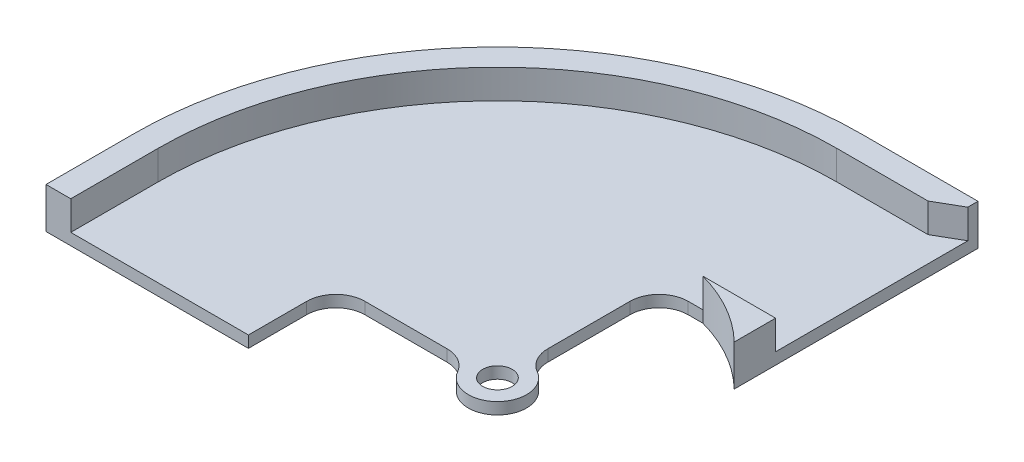
ISO-10303-21;
HEADER;
FILE_DESCRIPTION(('STEP AP214'),'2;1');
FILE_NAME('part.step','',(''),(''),'','','');
FILE_SCHEMA(('AUTOMOTIVE_DESIGN { 1 0 10303 214 1 1 1 1 }'));
ENDSEC;
DATA;
#1=APPLICATION_CONTEXT('core data for automotive mechanical design processes');
#2=APPLICATION_PROTOCOL_DEFINITION('international standard','automotive_design',2000,#1);
#3=PRODUCT_CONTEXT('',#1,'mechanical');
#4=PRODUCT('Part','Part','',(#3));
#5=PRODUCT_RELATED_PRODUCT_CATEGORY('part','',(#4));
#6=PRODUCT_DEFINITION_FORMATION('','',#4);
#7=PRODUCT_DEFINITION_CONTEXT('part definition',#1,'design');
#8=PRODUCT_DEFINITION('design','',#6,#7);
#9=PRODUCT_DEFINITION_SHAPE('','',#8);
#10=(LENGTH_UNIT() NAMED_UNIT(*) SI_UNIT(.MILLI.,.METRE.));
#11=(NAMED_UNIT(*) PLANE_ANGLE_UNIT() SI_UNIT($,.RADIAN.));
#12=(NAMED_UNIT(*) SI_UNIT($,.STERADIAN.) SOLID_ANGLE_UNIT());
#13=UNCERTAINTY_MEASURE_WITH_UNIT(LENGTH_MEASURE(1.E-05),#10,'distance_accuracy_value','');
#14=(GEOMETRIC_REPRESENTATION_CONTEXT(3) GLOBAL_UNCERTAINTY_ASSIGNED_CONTEXT((#13)) GLOBAL_UNIT_ASSIGNED_CONTEXT((#10,
#11,#12)) REPRESENTATION_CONTEXT('',''));
#15=CARTESIAN_POINT('',(0.,0.,0.));
#16=DIRECTION('',(0.,0.,1.));
#17=DIRECTION('',(1.,0.,0.));
#18=AXIS2_PLACEMENT_3D('',#15,#16,#17);
#19=CARTESIAN_POINT('',(62.5,84.1888396224811,6.99999999999996));
#20=DIRECTION('',(0.,0.,-1.));
#21=DIRECTION('',(-1.,0.,0.));
#22=AXIS2_PLACEMENT_3D('',#19,#20,#21);
#23=PLANE('',#22);
#24=DIRECTION('',(1.,0.,0.));
#25=VECTOR('',#24,1.);
#26=CARTESIAN_POINT('',(62.5,4.,6.99999999999996));
#27=LINE('',#26,#25);
#28=CARTESIAN_POINT('',(72.5,4.,6.99999999999996));
#29=VERTEX_POINT('',#28);
#30=CARTESIAN_POINT('',(77.533296378373,4.,6.99999999999997));
#31=VERTEX_POINT('',#30);
#32=EDGE_CURVE('E331',#29,#31,#27,.T.);
#33=ORIENTED_EDGE('',*,*,#32,.F.);
#34=DIRECTION('',(0.,-1.,0.));
#35=VECTOR('',#34,1.);
#36=CARTESIAN_POINT('',(72.5,0.,6.99999999999996));
#37=LINE('',#36,#35);
#38=CARTESIAN_POINT('',(72.5,0.,6.99999999999996));
#39=VERTEX_POINT('',#38);
#40=EDGE_CURVE('E198',#29,#39,#37,.T.);
#41=ORIENTED_EDGE('',*,*,#40,.T.);
#42=DIRECTION('',(1.,0.,0.));
#43=VECTOR('',#42,1.);
#44=CARTESIAN_POINT('',(62.5,0.,6.99999999999996));
#45=LINE('',#44,#43);
#46=CARTESIAN_POINT('',(77.533296378373,0.,6.99999999999997));
#47=VERTEX_POINT('',#46);
#48=EDGE_CURVE('E193',#39,#47,#45,.T.);
#49=ORIENTED_EDGE('',*,*,#48,.T.);
#50=DIRECTION('',(0.,-1.,0.));
#51=VECTOR('',#50,1.);
#52=CARTESIAN_POINT('',(77.533296378373,42.7190495858495,6.99999999999997));
#53=LINE('',#52,#51);
#54=EDGE_CURVE('E196',#31,#47,#53,.T.);
#55=ORIENTED_EDGE('',*,*,#54,.F.);
#56=EDGE_LOOP('',(#33,#41,#49,#55));
#57=FACE_BOUND('',#56,.T.);
#58=ADVANCED_FACE('F45',(#57),#23,.F.);
#59=CARTESIAN_POINT('',(62.5,4.,-62.5));
#60=DIRECTION('',(-1.,0.,0.));
#61=DIRECTION('',(0.,0.,1.));
#62=AXIS2_PLACEMENT_3D('',#59,#60,#61);
#63=PLANE('',#62);
#64=DIRECTION('',(0.,0.,-1.));
#65=VECTOR('',#64,1.);
#66=CARTESIAN_POINT('',(62.5,0.,-62.5));
#67=LINE('',#66,#65);
#68=CARTESIAN_POINT('',(62.5,0.,45.1794919243113));
#69=VERTEX_POINT('',#68);
#70=CARTESIAN_POINT('',(62.5,0.,17.));
#71=VERTEX_POINT('',#70);
#72=EDGE_CURVE('E330',#69,#71,#67,.T.);
#73=ORIENTED_EDGE('',*,*,#72,.T.);
#74=DIRECTION('',(0.,-1.,0.));
#75=VECTOR('',#74,1.);
#76=CARTESIAN_POINT('',(62.5,4.,17.));
#77=LINE('',#76,#75);
#78=CARTESIAN_POINT('',(62.5,4.,17.));
#79=VERTEX_POINT('',#78);
#80=EDGE_CURVE('E391',#71,#79,#77,.F.);
#81=ORIENTED_EDGE('',*,*,#80,.T.);
#82=DIRECTION('',(0.,0.,-1.));
#83=VECTOR('',#82,1.);
#84=CARTESIAN_POINT('',(62.5,4.,-62.5));
#85=LINE('',#84,#83);
#86=CARTESIAN_POINT('',(62.5,4.,45.1794919243113));
#87=VERTEX_POINT('',#86);
#88=EDGE_CURVE('E337',#87,#79,#85,.T.);
#89=ORIENTED_EDGE('',*,*,#88,.F.);
#90=DIRECTION('',(0.,1.,0.));
#91=VECTOR('',#90,1.);
#92=CARTESIAN_POINT('',(62.5,4.,45.1794919243113));
#93=LINE('',#92,#91);
#94=EDGE_CURVE('E387',#87,#69,#93,.F.);
#95=ORIENTED_EDGE('',*,*,#94,.T.);
#96=EDGE_LOOP('',(#73,#81,#89,#95));
#97=FACE_BOUND('',#96,.T.);
#98=ADVANCED_FACE('F495',(#97),#63,.F.);
#99=CARTESIAN_POINT('',(-62.5,4.,-62.5));
#100=DIRECTION('',(0.,0.,1.));
#101=DIRECTION('',(1.,0.,0.));
#102=AXIS2_PLACEMENT_3D('',#99,#100,#101);
#103=PLANE('',#102);
#104=DIRECTION('',(-1.,0.,0.));
#105=VECTOR('',#104,1.);
#106=CARTESIAN_POINT('',(-62.5,0.,-62.5));
#107=LINE('',#106,#105);
#108=CARTESIAN_POINT('',(102.5,0.,-62.5));
#109=VERTEX_POINT('',#108);
#110=CARTESIAN_POINT('',(62.5,0.,-62.5));
#111=VERTEX_POINT('',#110);
#112=EDGE_CURVE('E350',#109,#111,#107,.T.);
#113=ORIENTED_EDGE('',*,*,#112,.T.);
#114=DIRECTION('',(0.,-1.,0.));
#115=VECTOR('',#114,1.);
#116=CARTESIAN_POINT('',(62.5,4.,-62.5));
#117=LINE('',#116,#115);
#118=CARTESIAN_POINT('',(62.5,14.,-62.5));
#119=VERTEX_POINT('',#118);
#120=EDGE_CURVE('E366',#111,#119,#117,.F.);
#121=ORIENTED_EDGE('',*,*,#120,.T.);
#122=DIRECTION('',(-1.,0.,0.));
#123=VECTOR('',#122,1.);
#124=CARTESIAN_POINT('',(-62.5,14.,-62.5));
#125=LINE('',#124,#123);
#126=CARTESIAN_POINT('',(102.5,14.,-62.5));
#127=VERTEX_POINT('',#126);
#128=EDGE_CURVE('E276',#127,#119,#125,.T.);
#129=ORIENTED_EDGE('',*,*,#128,.F.);
#130=DIRECTION('',(0.,-1.,0.));
#131=VECTOR('',#130,1.);
#132=CARTESIAN_POINT('',(102.5,84.1888396224811,-62.5));
#133=LINE('',#132,#131);
#134=EDGE_CURVE('E325',#127,#109,#133,.T.);
#135=ORIENTED_EDGE('',*,*,#134,.T.);
#136=EDGE_LOOP('',(#113,#121,#129,#135));
#137=FACE_BOUND('',#136,.T.);
#138=ADVANCED_FACE('F480',(#137),#103,.F.);
#139=CARTESIAN_POINT('',(-62.5,4.,-62.5));
#140=DIRECTION('',(1.,0.,0.));
#141=DIRECTION('',(0.,0.,-1.));
#142=AXIS2_PLACEMENT_3D('',#139,#140,#141);
#143=PLANE('',#142);
#144=DIRECTION('',(0.,0.,1.));
#145=VECTOR('',#144,1.);
#146=CARTESIAN_POINT('',(-62.5,14.,92.5));
#147=LINE('',#146,#145);
#148=CARTESIAN_POINT('',(-62.5,14.,62.5));
#149=VERTEX_POINT('',#148);
#150=CARTESIAN_POINT('',(-62.5,14.,92.5));
#151=VERTEX_POINT('',#150);
#152=EDGE_CURVE('E280',#149,#151,#147,.T.);
#153=ORIENTED_EDGE('',*,*,#152,.F.);
#154=DIRECTION('',(0.,-1.,0.));
#155=VECTOR('',#154,1.);
#156=CARTESIAN_POINT('',(-62.5,4.,62.5));
#157=LINE('',#156,#155);
#158=CARTESIAN_POINT('',(-62.5,0.,62.5));
#159=VERTEX_POINT('',#158);
#160=EDGE_CURVE('E346',#149,#159,#157,.T.);
#161=ORIENTED_EDGE('',*,*,#160,.T.);
#162=DIRECTION('',(0.,0.,1.));
#163=VECTOR('',#162,1.);
#164=CARTESIAN_POINT('',(-62.5,0.,-62.5));
#165=LINE('',#164,#163);
#166=CARTESIAN_POINT('',(-62.5,0.,92.5));
#167=VERTEX_POINT('',#166);
#168=EDGE_CURVE('E354',#159,#167,#165,.T.);
#169=ORIENTED_EDGE('',*,*,#168,.T.);
#170=DIRECTION('',(0.,-1.,0.));
#171=VECTOR('',#170,1.);
#172=CARTESIAN_POINT('',(-62.5,79.6984147786464,92.5));
#173=LINE('',#172,#171);
#174=EDGE_CURVE('E305',#151,#167,#173,.T.);
#175=ORIENTED_EDGE('',*,*,#174,.F.);
#176=EDGE_LOOP('',(#153,#161,#169,#175));
#177=FACE_BOUND('',#176,.T.);
#178=ADVANCED_FACE('F472',(#177),#143,.F.);
#179=CARTESIAN_POINT('',(-62.5,4.,62.5));
#180=DIRECTION('',(0.,0.,-1.));
#181=DIRECTION('',(-1.,0.,0.));
#182=AXIS2_PLACEMENT_3D('',#179,#180,#181);
#183=PLANE('',#182);
#184=DIRECTION('',(1.,0.,0.));
#185=VECTOR('',#184,1.);
#186=CARTESIAN_POINT('',(-62.5,0.,62.5));
#187=LINE('',#186,#185);
#188=CARTESIAN_POINT('',(16.9999999999999,0.,62.5));
#189=VERTEX_POINT('',#188);
#190=CARTESIAN_POINT('',(45.1794919243112,0.,62.5));
#191=VERTEX_POINT('',#190);
#192=EDGE_CURVE('E342',#189,#191,#187,.T.);
#193=ORIENTED_EDGE('',*,*,#192,.T.);
#194=DIRECTION('',(0.,1.,0.));
#195=VECTOR('',#194,1.);
#196=CARTESIAN_POINT('',(45.1794919243112,4.,62.5));
#197=LINE('',#196,#195);
#198=CARTESIAN_POINT('',(45.1794919243112,4.,62.5));
#199=VERTEX_POINT('',#198);
#200=EDGE_CURVE('E404',#191,#199,#197,.T.);
#201=ORIENTED_EDGE('',*,*,#200,.T.);
#202=DIRECTION('',(1.,0.,0.));
#203=VECTOR('',#202,1.);
#204=CARTESIAN_POINT('',(-62.5,4.,62.5));
#205=LINE('',#204,#203);
#206=CARTESIAN_POINT('',(16.9999999999999,4.,62.5));
#207=VERTEX_POINT('',#206);
#208=EDGE_CURVE('E341',#207,#199,#205,.T.);
#209=ORIENTED_EDGE('',*,*,#208,.F.);
#210=DIRECTION('',(0.,-1.,0.));
#211=VECTOR('',#210,1.);
#212=CARTESIAN_POINT('',(16.9999999999999,0.,62.5));
#213=LINE('',#212,#211);
#214=EDGE_CURVE('E400',#207,#189,#213,.T.);
#215=ORIENTED_EDGE('',*,*,#214,.T.);
#216=EDGE_LOOP('',(#193,#201,#209,#215));
#217=FACE_BOUND('',#216,.T.);
#218=ADVANCED_FACE('F507',(#217),#183,.F.);
#219=CARTESIAN_POINT('',(0.,4.,0.));
#220=DIRECTION('',(0.,1.,0.));
#221=DIRECTION('',(0.,0.,1.));
#222=AXIS2_PLACEMENT_3D('',#219,#220,#221);
#223=PLANE('',#222);
#224=CARTESIAN_POINT('',(62.5,4.,62.5));
#225=DIRECTION('',(0.,1.,0.));
#226=DIRECTION('',(0.,0.,1.));
#227=AXIS2_PLACEMENT_3D('',#224,#225,#226);
#228=CIRCLE('',#227,5.075);
#229=CARTESIAN_POINT('',(62.5,4.,67.575));
#230=VERTEX_POINT('',#229);
#231=EDGE_CURVE('E241',#230,#230,#228,.T.);
#232=ORIENTED_EDGE('',*,*,#231,.F.);
#233=EDGE_LOOP('',(#232));
#234=FACE_BOUND('',#233,.T.);
#235=ORIENTED_EDGE('',*,*,#208,.T.);
#236=CARTESIAN_POINT('',(45.1794919243113,4.,72.5));
#237=DIRECTION('',(0.,1.,0.));
#238=DIRECTION('',(0.,0.,1.));
#239=AXIS2_PLACEMENT_3D('',#236,#237,#238);
#240=CIRCLE('',#239,10.);
#241=CARTESIAN_POINT('',(53.8397459621556,4.,67.5));
#242=VERTEX_POINT('',#241);
#243=EDGE_CURVE('E422',#199,#242,#240,.F.);
#244=ORIENTED_EDGE('',*,*,#243,.T.);
#245=CARTESIAN_POINT('',(62.5,4.,62.5));
#246=DIRECTION('',(0.,1.,0.));
#247=DIRECTION('',(0.,0.,1.));
#248=AXIS2_PLACEMENT_3D('',#245,#246,#247);
#249=CIRCLE('',#248,9.99999999999998);
#250=CARTESIAN_POINT('',(67.5,4.,53.8397459621556));
#251=VERTEX_POINT('',#250);
#252=EDGE_CURVE('E249',#242,#251,#249,.T.);
#253=ORIENTED_EDGE('',*,*,#252,.T.);
#254=CARTESIAN_POINT('',(72.5,4.,45.1794919243113));
#255=DIRECTION('',(0.,1.,0.));
#256=DIRECTION('',(0.,0.,1.));
#257=AXIS2_PLACEMENT_3D('',#254,#255,#256);
#258=CIRCLE('',#257,10.);
#259=EDGE_CURVE('E419',#251,#87,#258,.F.);
#260=ORIENTED_EDGE('',*,*,#259,.T.);
#261=ORIENTED_EDGE('',*,*,#88,.T.);
#262=CARTESIAN_POINT('',(72.5,4.,17.));
#263=DIRECTION('',(0.,1.,0.));
#264=DIRECTION('',(0.,0.,1.));
#265=AXIS2_PLACEMENT_3D('',#262,#263,#264);
#266=CIRCLE('',#265,10.);
#267=EDGE_CURVE('E413',#79,#29,#266,.F.);
#268=ORIENTED_EDGE('',*,*,#267,.T.);
#269=ORIENTED_EDGE('',*,*,#32,.T.);
#270=DIRECTION('',(1.,0.,0.));
#271=VECTOR('',#270,1.);
#272=CARTESIAN_POINT('',(0.,4.,6.99999999999996));
#273=LINE('',#272,#271);
#274=CARTESIAN_POINT('',(102.5,4.,6.99999999999996));
#275=VERTEX_POINT('',#274);
#276=EDGE_CURVE('E237',#31,#275,#273,.T.);
#277=ORIENTED_EDGE('',*,*,#276,.T.);
#278=DIRECTION('',(0.,0.,-1.));
#279=VECTOR('',#278,1.);
#280=CARTESIAN_POINT('',(102.5,4.,6.99999999999996));
#281=LINE('',#280,#279);
#282=CARTESIAN_POINT('',(102.5,4.,-59.));
#283=VERTEX_POINT('',#282);
#284=EDGE_CURVE('E327',#275,#283,#281,.T.);
#285=ORIENTED_EDGE('',*,*,#284,.T.);
#286=DIRECTION('',(0.866025403784439,0.,-0.5));
#287=VECTOR('',#286,1.);
#288=CARTESIAN_POINT('',(102.5,4.,-59.));
#289=LINE('',#288,#287);
#290=CARTESIAN_POINT('',(93.8397459621556,4.,-54.));
#291=VERTEX_POINT('',#290);
#292=EDGE_CURVE('E382',#283,#291,#289,.F.);
#293=ORIENTED_EDGE('',*,*,#292,.T.);
#294=DIRECTION('',(1.,0.,0.));
#295=VECTOR('',#294,1.);
#296=CARTESIAN_POINT('',(62.5,4.,-54.));
#297=LINE('',#296,#295);
#298=CARTESIAN_POINT('',(62.5,4.,-54.));
#299=VERTEX_POINT('',#298);
#300=EDGE_CURVE('E263',#299,#291,#297,.T.);
#301=ORIENTED_EDGE('',*,*,#300,.F.);
#302=CARTESIAN_POINT('',(62.5,4.,62.5));
#303=DIRECTION('',(0.,-1.,0.));
#304=DIRECTION('',(0.,0.,-1.));
#305=AXIS2_PLACEMENT_3D('',#302,#303,#304);
#306=CIRCLE('',#305,116.5);
#307=CARTESIAN_POINT('',(-54.,4.,62.5));
#308=VERTEX_POINT('',#307);
#309=EDGE_CURVE('E287',#308,#299,#306,.T.);
#310=ORIENTED_EDGE('',*,*,#309,.F.);
#311=DIRECTION('',(0.,0.,-1.));
#312=VECTOR('',#311,1.);
#313=CARTESIAN_POINT('',(-54.,4.,92.5));
#314=LINE('',#313,#312);
#315=CARTESIAN_POINT('',(-54.,4.,92.5));
#316=VERTEX_POINT('',#315);
#317=EDGE_CURVE('E257',#316,#308,#314,.T.);
#318=ORIENTED_EDGE('',*,*,#317,.F.);
#319=DIRECTION('',(1.,0.,0.));
#320=VECTOR('',#319,1.);
#321=CARTESIAN_POINT('',(-62.5,4.,92.5));
#322=LINE('',#321,#320);
#323=CARTESIAN_POINT('',(6.99999999999994,4.,92.5));
#324=VERTEX_POINT('',#323);
#325=EDGE_CURVE('E309',#316,#324,#322,.T.);
#326=ORIENTED_EDGE('',*,*,#325,.T.);
#327=DIRECTION('',(0.,0.,-1.));
#328=VECTOR('',#327,1.);
#329=CARTESIAN_POINT('',(6.99999999999994,4.,62.5));
#330=LINE('',#329,#328);
#331=CARTESIAN_POINT('',(6.99999999999994,4.,72.5));
#332=VERTEX_POINT('',#331);
#333=EDGE_CURVE('E202',#324,#332,#330,.T.);
#334=ORIENTED_EDGE('',*,*,#333,.T.);
#335=CARTESIAN_POINT('',(16.9999999999999,4.,72.5));
#336=DIRECTION('',(0.,1.,0.));
#337=DIRECTION('',(0.,0.,1.));
#338=AXIS2_PLACEMENT_3D('',#335,#336,#337);
#339=CIRCLE('',#338,10.);
#340=EDGE_CURVE('E11',#332,#207,#339,.F.);
#341=ORIENTED_EDGE('',*,*,#340,.T.);
#342=EDGE_LOOP('',(#235,#244,#253,#260,#261,#268,#269,#277,#285,#293,#301,#310,#318,#326,#334,#341));
#343=FACE_BOUND('',#342,.T.);
#344=ADVANCED_FACE('F439',(#234,#343),#223,.T.);
#345=CARTESIAN_POINT('',(0.,0.,0.));
#346=DIRECTION('',(0.,1.,0.));
#347=DIRECTION('',(0.,0.,1.));
#348=AXIS2_PLACEMENT_3D('',#345,#346,#347);
#349=PLANE('',#348);
#350=CARTESIAN_POINT('',(62.5,0.,62.5));
#351=DIRECTION('',(0.,1.,0.));
#352=DIRECTION('',(0.,0.,1.));
#353=AXIS2_PLACEMENT_3D('',#350,#351,#352);
#354=CIRCLE('',#353,5.075);
#355=CARTESIAN_POINT('',(62.5,0.,67.575));
#356=VERTEX_POINT('',#355);
#357=EDGE_CURVE('E245',#356,#356,#354,.F.);
#358=ORIENTED_EDGE('',*,*,#357,.F.);
#359=EDGE_LOOP('',(#358));
#360=FACE_BOUND('',#359,.T.);
#361=ORIENTED_EDGE('',*,*,#168,.F.);
#362=CARTESIAN_POINT('',(62.5,0.,62.5));
#363=DIRECTION('',(0.,1.,0.));
#364=DIRECTION('',(0.,0.,1.));
#365=AXIS2_PLACEMENT_3D('',#362,#363,#364);
#366=CIRCLE('',#365,125.);
#367=EDGE_CURVE('E363',#159,#111,#366,.F.);
#368=ORIENTED_EDGE('',*,*,#367,.T.);
#369=ORIENTED_EDGE('',*,*,#112,.F.);
#370=DIRECTION('',(0.,0.,-1.));
#371=VECTOR('',#370,1.);
#372=CARTESIAN_POINT('',(102.5,0.,6.99999999999996));
#373=LINE('',#372,#371);
#374=CARTESIAN_POINT('',(102.5,0.,21.1932208953542));
#375=VERTEX_POINT('',#374);
#376=EDGE_CURVE('E201',#375,#109,#373,.T.);
#377=ORIENTED_EDGE('',*,*,#376,.F.);
#378=CARTESIAN_POINT('',(62.5,0.,62.5));
#379=DIRECTION('',(0.,-1.,0.));
#380=DIRECTION('',(0.,0.,-1.));
#381=AXIS2_PLACEMENT_3D('',#378,#379,#380);
#382=CIRCLE('',#381,57.5);
#383=EDGE_CURVE('E209',#47,#375,#382,.T.);
#384=ORIENTED_EDGE('',*,*,#383,.F.);
#385=ORIENTED_EDGE('',*,*,#48,.F.);
#386=CARTESIAN_POINT('',(72.5,0.,17.));
#387=DIRECTION('',(0.,1.,0.));
#388=DIRECTION('',(0.,0.,1.));
#389=AXIS2_PLACEMENT_3D('',#386,#387,#388);
#390=CIRCLE('',#389,10.);
#391=EDGE_CURVE('E410',#39,#71,#390,.T.);
#392=ORIENTED_EDGE('',*,*,#391,.T.);
#393=ORIENTED_EDGE('',*,*,#72,.F.);
#394=CARTESIAN_POINT('',(72.5,0.,45.1794919243113));
#395=DIRECTION('',(0.,1.,0.));
#396=DIRECTION('',(0.,0.,1.));
#397=AXIS2_PLACEMENT_3D('',#394,#395,#396);
#398=CIRCLE('',#397,10.);
#399=CARTESIAN_POINT('',(67.5,0.,53.8397459621556));
#400=VERTEX_POINT('',#399);
#401=EDGE_CURVE('E416',#69,#400,#398,.T.);
#402=ORIENTED_EDGE('',*,*,#401,.T.);
#403=CARTESIAN_POINT('',(62.5,0.,62.5));
#404=DIRECTION('',(0.,1.,0.));
#405=DIRECTION('',(0.,0.,1.));
#406=AXIS2_PLACEMENT_3D('',#403,#404,#405);
#407=CIRCLE('',#406,9.99999999999998);
#408=CARTESIAN_POINT('',(53.8397459621556,0.,67.5));
#409=VERTEX_POINT('',#408);
#410=EDGE_CURVE('E253',#400,#409,#407,.F.);
#411=ORIENTED_EDGE('',*,*,#410,.T.);
#412=CARTESIAN_POINT('',(45.1794919243113,0.,72.5));
#413=DIRECTION('',(0.,1.,0.));
#414=DIRECTION('',(0.,0.,1.));
#415=AXIS2_PLACEMENT_3D('',#412,#413,#414);
#416=CIRCLE('',#415,10.);
#417=EDGE_CURVE('E425',#409,#191,#416,.T.);
#418=ORIENTED_EDGE('',*,*,#417,.T.);
#419=ORIENTED_EDGE('',*,*,#192,.F.);
#420=CARTESIAN_POINT('',(16.9999999999999,0.,72.5));
#421=DIRECTION('',(0.,1.,0.));
#422=DIRECTION('',(0.,0.,1.));
#423=AXIS2_PLACEMENT_3D('',#420,#421,#422);
#424=CIRCLE('',#423,10.);
#425=CARTESIAN_POINT('',(6.99999999999994,0.,72.5));
#426=VERTEX_POINT('',#425);
#427=EDGE_CURVE('E54',#189,#426,#424,.T.);
#428=ORIENTED_EDGE('',*,*,#427,.T.);
#429=DIRECTION('',(0.,0.,-1.));
#430=VECTOR('',#429,1.);
#431=CARTESIAN_POINT('',(6.99999999999994,0.,62.5));
#432=LINE('',#431,#430);
#433=CARTESIAN_POINT('',(6.99999999999994,0.,92.5));
#434=VERTEX_POINT('',#433);
#435=EDGE_CURVE('E306',#434,#426,#432,.T.);
#436=ORIENTED_EDGE('',*,*,#435,.F.);
#437=DIRECTION('',(1.,0.,0.));
#438=VECTOR('',#437,1.);
#439=CARTESIAN_POINT('',(-62.5,0.,92.5));
#440=LINE('',#439,#438);
#441=EDGE_CURVE('E311',#167,#434,#440,.T.);
#442=ORIENTED_EDGE('',*,*,#441,.F.);
#443=EDGE_LOOP('',(#361,#368,#369,#377,#384,#385,#392,#393,#402,#411,#418,#419,#428,#436,#442));
#444=FACE_BOUND('',#443,.T.);
#445=ADVANCED_FACE('F217',(#360,#444),#349,.F.);
#446=CARTESIAN_POINT('',(102.5,84.1888396224811,6.99999999999996));
#447=DIRECTION('',(-1.,0.,0.));
#448=DIRECTION('',(0.,0.,1.));
#449=AXIS2_PLACEMENT_3D('',#446,#447,#448);
#450=PLANE('',#449);
#451=DIRECTION('',(0.,0.,-1.));
#452=VECTOR('',#451,1.);
#453=CARTESIAN_POINT('',(102.5,14.,-54.));
#454=LINE('',#453,#452);
#455=CARTESIAN_POINT('',(102.5,14.,-59.));
#456=VERTEX_POINT('',#455);
#457=EDGE_CURVE('E273',#456,#127,#454,.T.);
#458=ORIENTED_EDGE('',*,*,#457,.F.);
#459=DIRECTION('',(0.,-1.,0.));
#460=VECTOR('',#459,1.);
#461=CARTESIAN_POINT('',(102.5,84.1888396224811,-59.));
#462=LINE('',#461,#460);
#463=EDGE_CURVE('E372',#456,#283,#462,.T.);
#464=ORIENTED_EDGE('',*,*,#463,.T.);
#465=ORIENTED_EDGE('',*,*,#284,.F.);
#466=DIRECTION('',(0.,-1.,0.));
#467=VECTOR('',#466,1.);
#468=CARTESIAN_POINT('',(102.5,42.7190495858495,6.99999999999996));
#469=LINE('',#468,#467);
#470=CARTESIAN_POINT('',(102.5,14.,6.99999999999996));
#471=VERTEX_POINT('',#470);
#472=EDGE_CURVE('E221',#471,#275,#469,.T.);
#473=ORIENTED_EDGE('',*,*,#472,.F.);
#474=DIRECTION('',(0.,0.,1.));
#475=VECTOR('',#474,1.);
#476=CARTESIAN_POINT('',(102.5,14.,6.99999999999996));
#477=LINE('',#476,#475);
#478=CARTESIAN_POINT('',(102.5,14.,21.1932208953542));
#479=VERTEX_POINT('',#478);
#480=EDGE_CURVE('E232',#471,#479,#477,.T.);
#481=ORIENTED_EDGE('',*,*,#480,.T.);
#482=DIRECTION('',(0.,-1.,0.));
#483=VECTOR('',#482,1.);
#484=CARTESIAN_POINT('',(102.5,42.7190495858495,21.1932208953542));
#485=LINE('',#484,#483);
#486=EDGE_CURVE('E214',#479,#375,#485,.T.);
#487=ORIENTED_EDGE('',*,*,#486,.T.);
#488=ORIENTED_EDGE('',*,*,#376,.T.);
#489=ORIENTED_EDGE('',*,*,#134,.F.);
#490=EDGE_LOOP('',(#458,#464,#465,#473,#481,#487,#488,#489));
#491=FACE_BOUND('',#490,.T.);
#492=ADVANCED_FACE('F443',(#491),#450,.F.);
#493=CARTESIAN_POINT('',(-62.5,79.6984147786464,92.5));
#494=DIRECTION('',(0.,0.,-1.));
#495=DIRECTION('',(-1.,0.,0.));
#496=AXIS2_PLACEMENT_3D('',#493,#494,#495);
#497=PLANE('',#496);
#498=ORIENTED_EDGE('',*,*,#325,.F.);
#499=DIRECTION('',(0.,-1.,0.));
#500=VECTOR('',#499,1.);
#501=CARTESIAN_POINT('',(-54.,14.,92.5));
#502=LINE('',#501,#500);
#503=CARTESIAN_POINT('',(-54.,14.,92.5));
#504=VERTEX_POINT('',#503);
#505=EDGE_CURVE('E301',#504,#316,#502,.T.);
#506=ORIENTED_EDGE('',*,*,#505,.F.);
#507=DIRECTION('',(1.,0.,0.));
#508=VECTOR('',#507,1.);
#509=CARTESIAN_POINT('',(-62.5,14.,92.5));
#510=LINE('',#509,#508);
#511=EDGE_CURVE('E258',#151,#504,#510,.T.);
#512=ORIENTED_EDGE('',*,*,#511,.F.);
#513=ORIENTED_EDGE('',*,*,#174,.T.);
#514=ORIENTED_EDGE('',*,*,#441,.T.);
#515=DIRECTION('',(0.,-1.,0.));
#516=VECTOR('',#515,1.);
#517=CARTESIAN_POINT('',(6.99999999999994,79.6984147786464,92.5));
#518=LINE('',#517,#516);
#519=EDGE_CURVE('E310',#324,#434,#518,.T.);
#520=ORIENTED_EDGE('',*,*,#519,.F.);
#521=EDGE_LOOP('',(#498,#506,#512,#513,#514,#520));
#522=FACE_BOUND('',#521,.T.);
#523=ADVANCED_FACE('F464',(#522),#497,.F.);
#524=CARTESIAN_POINT('',(6.99999999999994,79.6984147786464,62.5));
#525=DIRECTION('',(-1.,0.,0.));
#526=DIRECTION('',(0.,0.,1.));
#527=AXIS2_PLACEMENT_3D('',#524,#525,#526);
#528=PLANE('',#527);
#529=ORIENTED_EDGE('',*,*,#435,.T.);
#530=DIRECTION('',(0.,-1.,0.));
#531=VECTOR('',#530,1.);
#532=CARTESIAN_POINT('',(6.99999999999994,4.,72.5));
#533=LINE('',#532,#531);
#534=EDGE_CURVE('E67',#426,#332,#533,.F.);
#535=ORIENTED_EDGE('',*,*,#534,.T.);
#536=ORIENTED_EDGE('',*,*,#333,.F.);
#537=ORIENTED_EDGE('',*,*,#519,.T.);
#538=EDGE_LOOP('',(#529,#535,#536,#537));
#539=FACE_BOUND('',#538,.T.);
#540=ADVANCED_FACE('F467',(#539),#528,.F.);
#541=CARTESIAN_POINT('',(-54.,14.,92.5));
#542=DIRECTION('',(-1.,0.,0.));
#543=DIRECTION('',(0.,0.,1.));
#544=AXIS2_PLACEMENT_3D('',#541,#542,#543);
#545=PLANE('',#544);
#546=ORIENTED_EDGE('',*,*,#317,.T.);
#547=DIRECTION('',(0.,-1.,0.));
#548=VECTOR('',#547,1.);
#549=CARTESIAN_POINT('',(-54.,14.,62.5));
#550=LINE('',#549,#548);
#551=CARTESIAN_POINT('',(-54.,14.,62.5));
#552=VERTEX_POINT('',#551);
#553=EDGE_CURVE('E297',#552,#308,#550,.T.);
#554=ORIENTED_EDGE('',*,*,#553,.F.);
#555=DIRECTION('',(0.,0.,-1.));
#556=VECTOR('',#555,1.);
#557=CARTESIAN_POINT('',(-54.,14.,92.5));
#558=LINE('',#557,#556);
#559=EDGE_CURVE('E262',#504,#552,#558,.T.);
#560=ORIENTED_EDGE('',*,*,#559,.F.);
#561=ORIENTED_EDGE('',*,*,#505,.T.);
#562=EDGE_LOOP('',(#546,#554,#560,#561));
#563=FACE_BOUND('',#562,.T.);
#564=ADVANCED_FACE('F460',(#563),#545,.F.);
#565=CARTESIAN_POINT('',(62.5,14.,62.5));
#566=DIRECTION('',(0.,-1.,0.));
#567=DIRECTION('',(0.,0.,-1.));
#568=AXIS2_PLACEMENT_3D('',#565,#566,#567);
#569=CYLINDRICAL_SURFACE('',#568,116.5);
#570=ORIENTED_EDGE('',*,*,#309,.T.);
#571=DIRECTION('',(0.,-1.,0.));
#572=VECTOR('',#571,1.);
#573=CARTESIAN_POINT('',(62.5,14.,-54.));
#574=LINE('',#573,#572);
#575=CARTESIAN_POINT('',(62.5,14.,-54.));
#576=VERTEX_POINT('',#575);
#577=EDGE_CURVE('E283',#576,#299,#574,.T.);
#578=ORIENTED_EDGE('',*,*,#577,.F.);
#579=CARTESIAN_POINT('',(62.5,14.,62.5));
#580=DIRECTION('',(0.,-1.,0.));
#581=DIRECTION('',(0.,0.,-1.));
#582=AXIS2_PLACEMENT_3D('',#579,#580,#581);
#583=CIRCLE('',#582,116.5);
#584=EDGE_CURVE('E266',#552,#576,#583,.T.);
#585=ORIENTED_EDGE('',*,*,#584,.F.);
#586=ORIENTED_EDGE('',*,*,#553,.T.);
#587=EDGE_LOOP('',(#570,#578,#585,#586));
#588=FACE_BOUND('',#587,.T.);
#589=ADVANCED_FACE('F456',(#588),#569,.F.);
#590=CARTESIAN_POINT('',(62.5,14.,-54.));
#591=DIRECTION('',(0.,0.,-1.));
#592=DIRECTION('',(-1.,0.,0.));
#593=AXIS2_PLACEMENT_3D('',#590,#591,#592);
#594=PLANE('',#593);
#595=ORIENTED_EDGE('',*,*,#300,.T.);
#596=DIRECTION('',(0.,1.,0.));
#597=VECTOR('',#596,1.);
#598=CARTESIAN_POINT('',(93.8397459621556,14.,-54.));
#599=LINE('',#598,#597);
#600=CARTESIAN_POINT('',(93.8397459621556,14.,-54.));
#601=VERTEX_POINT('',#600);
#602=EDGE_CURVE('E376',#291,#601,#599,.T.);
#603=ORIENTED_EDGE('',*,*,#602,.T.);
#604=DIRECTION('',(1.,0.,0.));
#605=VECTOR('',#604,1.);
#606=CARTESIAN_POINT('',(62.5,14.,-54.));
#607=LINE('',#606,#605);
#608=EDGE_CURVE('E269',#576,#601,#607,.T.);
#609=ORIENTED_EDGE('',*,*,#608,.F.);
#610=ORIENTED_EDGE('',*,*,#577,.T.);
#611=EDGE_LOOP('',(#595,#603,#609,#610));
#612=FACE_BOUND('',#611,.T.);
#613=ADVANCED_FACE('F451',(#612),#594,.F.);
#614=CARTESIAN_POINT('',(62.5,14.,62.5));
#615=DIRECTION('',(0.,-1.,0.));
#616=DIRECTION('',(0.,0.,-1.));
#617=AXIS2_PLACEMENT_3D('',#614,#615,#616);
#618=PLANE('',#617);
#619=ORIENTED_EDGE('',*,*,#608,.T.);
#620=DIRECTION('',(-0.866025403784439,0.,0.5));
#621=VECTOR('',#620,1.);
#622=CARTESIAN_POINT('',(102.5,14.,-59.));
#623=LINE('',#622,#621);
#624=EDGE_CURVE('E379',#601,#456,#623,.F.);
#625=ORIENTED_EDGE('',*,*,#624,.T.);
#626=ORIENTED_EDGE('',*,*,#457,.T.);
#627=ORIENTED_EDGE('',*,*,#128,.T.);
#628=CARTESIAN_POINT('',(62.5,14.,62.5));
#629=DIRECTION('',(0.,-1.,0.));
#630=DIRECTION('',(0.,0.,-1.));
#631=AXIS2_PLACEMENT_3D('',#628,#629,#630);
#632=CIRCLE('',#631,125.);
#633=EDGE_CURVE('E369',#119,#149,#632,.F.);
#634=ORIENTED_EDGE('',*,*,#633,.T.);
#635=ORIENTED_EDGE('',*,*,#152,.T.);
#636=ORIENTED_EDGE('',*,*,#511,.T.);
#637=ORIENTED_EDGE('',*,*,#559,.T.);
#638=ORIENTED_EDGE('',*,*,#584,.T.);
#639=EDGE_LOOP('',(#619,#625,#626,#627,#634,#635,#636,#637,#638));
#640=FACE_BOUND('',#639,.T.);
#641=ADVANCED_FACE('F482',(#640),#618,.F.);
#642=CARTESIAN_POINT('',(62.5,-28.2842712474618,62.5));
#643=DIRECTION('',(0.,1.,0.));
#644=DIRECTION('',(0.,0.,1.));
#645=AXIS2_PLACEMENT_3D('',#642,#643,#644);
#646=CYLINDRICAL_SURFACE('',#645,9.99999999999998);
#647=ORIENTED_EDGE('',*,*,#410,.F.);
#648=DIRECTION('',(0.,1.,0.));
#649=VECTOR('',#648,1.);
#650=CARTESIAN_POINT('',(67.5,-28.2842712474618,53.8397459621556));
#651=LINE('',#650,#649);
#652=EDGE_CURVE('E397',#400,#251,#651,.T.);
#653=ORIENTED_EDGE('',*,*,#652,.T.);
#654=ORIENTED_EDGE('',*,*,#252,.F.);
#655=DIRECTION('',(0.,1.,0.));
#656=VECTOR('',#655,1.);
#657=CARTESIAN_POINT('',(53.8397459621556,-28.2842712474618,67.5));
#658=LINE('',#657,#656);
#659=EDGE_CURVE('E394',#242,#409,#658,.F.);
#660=ORIENTED_EDGE('',*,*,#659,.T.);
#661=EDGE_LOOP('',(#647,#653,#654,#660));
#662=FACE_BOUND('',#661,.T.);
#663=ADVANCED_FACE('F484',(#662),#646,.T.);
#664=CARTESIAN_POINT('',(62.5,-14.3542676580869,62.5));
#665=DIRECTION('',(0.,1.,0.));
#666=DIRECTION('',(0.,0.,1.));
#667=AXIS2_PLACEMENT_3D('',#664,#665,#666);
#668=CYLINDRICAL_SURFACE('',#667,5.075);
#669=ORIENTED_EDGE('',*,*,#357,.T.);
#670=EDGE_LOOP('',(#669));
#671=FACE_BOUND('',#670,.T.);
#672=ORIENTED_EDGE('',*,*,#231,.T.);
#673=EDGE_LOOP('',(#672));
#674=FACE_BOUND('',#673,.T.);
#675=ADVANCED_FACE('F490',(#671,#674),#668,.F.);
#676=CARTESIAN_POINT('',(62.5,4.,62.5));
#677=DIRECTION('',(0.,-1.,0.));
#678=DIRECTION('',(0.,0.,-1.));
#679=AXIS2_PLACEMENT_3D('',#676,#677,#678);
#680=CYLINDRICAL_SURFACE('',#679,125.);
#681=ORIENTED_EDGE('',*,*,#633,.F.);
#682=ORIENTED_EDGE('',*,*,#120,.F.);
#683=ORIENTED_EDGE('',*,*,#367,.F.);
#684=ORIENTED_EDGE('',*,*,#160,.F.);
#685=EDGE_LOOP('',(#681,#682,#683,#684));
#686=FACE_BOUND('',#685,.T.);
#687=ADVANCED_FACE('F476',(#686),#680,.T.);
#688=CARTESIAN_POINT('',(102.5,84.1888396224811,-59.));
#689=DIRECTION('',(-0.5,0.,-0.866025403784439));
#690=DIRECTION('',(0.,-1.,0.));
#691=AXIS2_PLACEMENT_3D('',#688,#689,#690);
#692=PLANE('',#691);
#693=ORIENTED_EDGE('',*,*,#624,.F.);
#694=ORIENTED_EDGE('',*,*,#602,.F.);
#695=ORIENTED_EDGE('',*,*,#292,.F.);
#696=ORIENTED_EDGE('',*,*,#463,.F.);
#697=EDGE_LOOP('',(#693,#694,#695,#696));
#698=FACE_BOUND('',#697,.T.);
#699=ADVANCED_FACE('F448',(#698),#692,.F.);
#700=CARTESIAN_POINT('',(62.5,42.7190495858495,62.5));
#701=DIRECTION('',(0.,-1.,0.));
#702=DIRECTION('',(0.,0.,-1.));
#703=AXIS2_PLACEMENT_3D('',#700,#701,#702);
#704=CYLINDRICAL_SURFACE('',#703,57.5);
#705=ORIENTED_EDGE('',*,*,#486,.F.);
#706=CARTESIAN_POINT('',(62.5,14.,62.5));
#707=DIRECTION('',(0.,-1.,0.));
#708=DIRECTION('',(0.,0.,-1.));
#709=AXIS2_PLACEMENT_3D('',#706,#707,#708);
#710=CIRCLE('',#709,57.5);
#711=CARTESIAN_POINT('',(77.533296378373,14.,6.99999999999997));
#712=VERTEX_POINT('',#711);
#713=EDGE_CURVE('E236',#479,#712,#710,.F.);
#714=ORIENTED_EDGE('',*,*,#713,.T.);
#715=EDGE_CURVE('E212',#712,#31,#53,.T.);
#716=ORIENTED_EDGE('',*,*,#715,.T.);
#717=ORIENTED_EDGE('',*,*,#54,.T.);
#718=ORIENTED_EDGE('',*,*,#383,.T.);
#719=EDGE_LOOP('',(#705,#714,#716,#717,#718));
#720=FACE_BOUND('',#719,.T.);
#721=ADVANCED_FACE('F208',(#720),#704,.F.);
#722=CARTESIAN_POINT('',(102.5,42.7190495858495,6.99999999999996));
#723=DIRECTION('',(0.,0.,1.));
#724=DIRECTION('',(1.,0.,0.));
#725=AXIS2_PLACEMENT_3D('',#722,#723,#724);
#726=PLANE('',#725);
#727=ORIENTED_EDGE('',*,*,#276,.F.);
#728=ORIENTED_EDGE('',*,*,#715,.F.);
#729=DIRECTION('',(1.,0.,0.));
#730=VECTOR('',#729,1.);
#731=CARTESIAN_POINT('',(102.5,14.,6.99999999999996));
#732=LINE('',#731,#730);
#733=EDGE_CURVE('E226',#712,#471,#732,.T.);
#734=ORIENTED_EDGE('',*,*,#733,.T.);
#735=ORIENTED_EDGE('',*,*,#472,.T.);
#736=EDGE_LOOP('',(#727,#728,#734,#735));
#737=FACE_BOUND('',#736,.T.);
#738=ADVANCED_FACE('F436',(#737),#726,.F.);
#739=CARTESIAN_POINT('',(62.5,14.,62.5));
#740=DIRECTION('',(0.,-1.,0.));
#741=DIRECTION('',(0.,0.,-1.));
#742=AXIS2_PLACEMENT_3D('',#739,#740,#741);
#743=PLANE('',#742);
#744=ORIENTED_EDGE('',*,*,#713,.F.);
#745=ORIENTED_EDGE('',*,*,#480,.F.);
#746=ORIENTED_EDGE('',*,*,#733,.F.);
#747=EDGE_LOOP('',(#744,#745,#746));
#748=FACE_BOUND('',#747,.T.);
#749=ADVANCED_FACE('F432',(#748),#743,.F.);
#750=CARTESIAN_POINT('',(72.5,84.1888396224811,17.));
#751=DIRECTION('',(0.,1.,0.));
#752=DIRECTION('',(0.,0.,1.));
#753=AXIS2_PLACEMENT_3D('',#750,#751,#752);
#754=CYLINDRICAL_SURFACE('',#753,10.);
#755=ORIENTED_EDGE('',*,*,#267,.F.);
#756=ORIENTED_EDGE('',*,*,#80,.F.);
#757=ORIENTED_EDGE('',*,*,#391,.F.);
#758=ORIENTED_EDGE('',*,*,#40,.F.);
#759=EDGE_LOOP('',(#755,#756,#757,#758));
#760=FACE_BOUND('',#759,.T.);
#761=ADVANCED_FACE('F526',(#760),#754,.F.);
#762=CARTESIAN_POINT('',(72.5,-28.2842712474618,45.1794919243113));
#763=DIRECTION('',(0.,1.,0.));
#764=DIRECTION('',(0.,0.,1.));
#765=AXIS2_PLACEMENT_3D('',#762,#763,#764);
#766=CYLINDRICAL_SURFACE('',#765,10.);
#767=ORIENTED_EDGE('',*,*,#259,.F.);
#768=ORIENTED_EDGE('',*,*,#652,.F.);
#769=ORIENTED_EDGE('',*,*,#401,.F.);
#770=ORIENTED_EDGE('',*,*,#94,.F.);
#771=EDGE_LOOP('',(#767,#768,#769,#770));
#772=FACE_BOUND('',#771,.T.);
#773=ADVANCED_FACE('F529',(#772),#766,.F.);
#774=CARTESIAN_POINT('',(45.1794919243113,-28.2842712474618,72.5));
#775=DIRECTION('',(0.,1.,0.));
#776=DIRECTION('',(0.,0.,1.));
#777=AXIS2_PLACEMENT_3D('',#774,#775,#776);
#778=CYLINDRICAL_SURFACE('',#777,10.);
#779=ORIENTED_EDGE('',*,*,#417,.F.);
#780=ORIENTED_EDGE('',*,*,#659,.F.);
#781=ORIENTED_EDGE('',*,*,#243,.F.);
#782=ORIENTED_EDGE('',*,*,#200,.F.);
#783=EDGE_LOOP('',(#779,#780,#781,#782));
#784=FACE_BOUND('',#783,.T.);
#785=ADVANCED_FACE('F532',(#784),#778,.F.);
#786=CARTESIAN_POINT('',(16.9999999999999,4.,72.5));
#787=DIRECTION('',(0.,1.,0.));
#788=DIRECTION('',(0.,0.,1.));
#789=AXIS2_PLACEMENT_3D('',#786,#787,#788);
#790=CYLINDRICAL_SURFACE('',#789,10.);
#791=ORIENTED_EDGE('',*,*,#340,.F.);
#792=ORIENTED_EDGE('',*,*,#534,.F.);
#793=ORIENTED_EDGE('',*,*,#427,.F.);
#794=ORIENTED_EDGE('',*,*,#214,.F.);
#795=EDGE_LOOP('',(#791,#792,#793,#794));
#796=FACE_BOUND('',#795,.T.);
#797=ADVANCED_FACE('F47',(#796),#790,.F.);
#798=CLOSED_SHELL('',(#58,#98,#138,#178,#218,#344,#445,#492,#523,#540,#564,#589,#613,#641,#663,
#675,#687,#699,#721,#738,#749,#761,#773,#785,#797));
#799=MANIFOLD_SOLID_BREP('B2',#798);
#800=ADVANCED_BREP_SHAPE_REPRESENTATION('',(#18,#799),#14);
#801=SHAPE_DEFINITION_REPRESENTATION(#9,#800);
ENDSEC;
END-ISO-10303-21;
